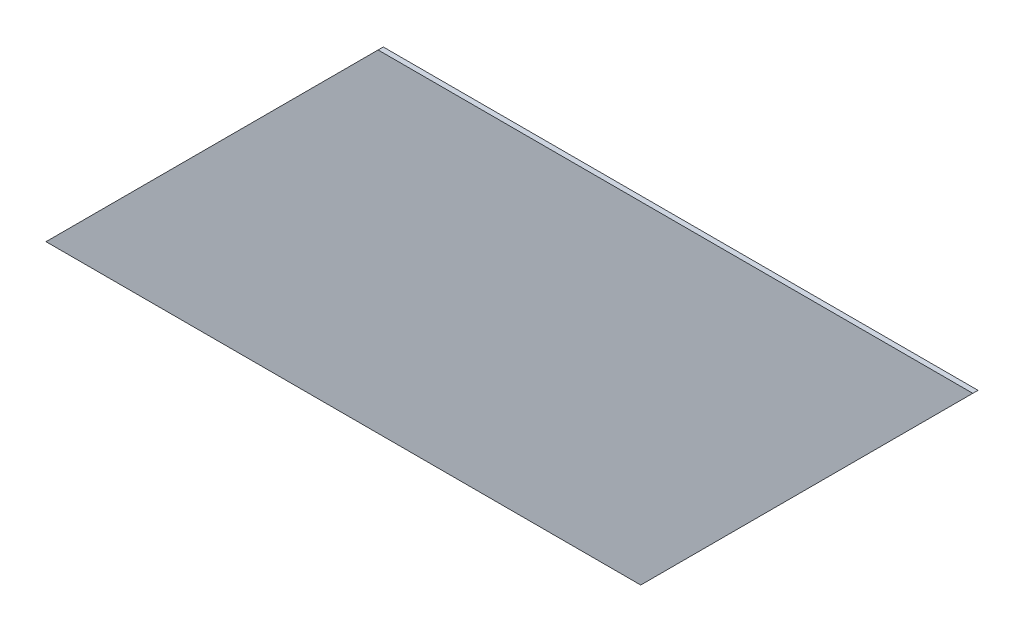
ISO-10303-21;
HEADER;
FILE_DESCRIPTION(('STEP AP214'),'2;1');
FILE_NAME('part.step','',(''),(''),'','','');
FILE_SCHEMA(('AUTOMOTIVE_DESIGN { 1 0 10303 214 1 1 1 1 }'));
ENDSEC;
DATA;
#1=APPLICATION_CONTEXT('core data for automotive mechanical design processes');
#2=APPLICATION_PROTOCOL_DEFINITION('international standard','automotive_design',2000,#1);
#3=PRODUCT_CONTEXT('',#1,'mechanical');
#4=PRODUCT('Part','Part','',(#3));
#5=PRODUCT_RELATED_PRODUCT_CATEGORY('part','',(#4));
#6=PRODUCT_DEFINITION_FORMATION('','',#4);
#7=PRODUCT_DEFINITION_CONTEXT('part definition',#1,'design');
#8=PRODUCT_DEFINITION('design','',#6,#7);
#9=PRODUCT_DEFINITION_SHAPE('','',#8);
#10=(LENGTH_UNIT() NAMED_UNIT(*) SI_UNIT(.MILLI.,.METRE.));
#11=(NAMED_UNIT(*) PLANE_ANGLE_UNIT() SI_UNIT($,.RADIAN.));
#12=(NAMED_UNIT(*) SI_UNIT($,.STERADIAN.) SOLID_ANGLE_UNIT());
#13=UNCERTAINTY_MEASURE_WITH_UNIT(LENGTH_MEASURE(1.E-05),#10,'distance_accuracy_value','');
#14=(GEOMETRIC_REPRESENTATION_CONTEXT(3) GLOBAL_UNCERTAINTY_ASSIGNED_CONTEXT((#13)) GLOBAL_UNIT_ASSIGNED_CONTEXT((#10,
#11,#12)) REPRESENTATION_CONTEXT('',''));
#15=CARTESIAN_POINT('',(0.,0.,0.));
#16=DIRECTION('',(0.,0.,1.));
#17=DIRECTION('',(1.,0.,0.));
#18=AXIS2_PLACEMENT_3D('',#15,#16,#17);
#19=CARTESIAN_POINT('',(-181.9529,-101.6,3.175));
#20=DIRECTION('',(0.707106781186549,-0.707106781186546,0.));
#21=DIRECTION('',(0.707106781186546,0.707106781186549,0.));
#22=AXIS2_PLACEMENT_3D('',#19,#20,#21);
#23=PLANE('',#22);
#24=DIRECTION('',(-0.707106781186546,-0.707106781186549,0.));
#25=VECTOR('',#24,1.);
#26=CARTESIAN_POINT('',(-181.9529,-101.6,0.));
#27=LINE('',#26,#25);
#28=CARTESIAN_POINT('',(21.2470999999992,101.6,0.));
#29=VERTEX_POINT('',#28);
#30=CARTESIAN_POINT('',(-181.9529,-101.6,0.));
#31=VERTEX_POINT('',#30);
#32=EDGE_CURVE('E87',#29,#31,#27,.T.);
#33=ORIENTED_EDGE('',*,*,#32,.T.);
#34=DIRECTION('',(0.,0.,-1.));
#35=VECTOR('',#34,1.);
#36=CARTESIAN_POINT('',(-181.9529,-101.6,3.175));
#37=LINE('',#36,#35);
#38=CARTESIAN_POINT('',(-181.9529,-101.6,3.175));
#39=VERTEX_POINT('',#38);
#40=EDGE_CURVE('E41',#39,#31,#37,.T.);
#41=ORIENTED_EDGE('',*,*,#40,.F.);
#42=DIRECTION('',(-0.707106781186546,-0.707106781186549,0.));
#43=VECTOR('',#42,1.);
#44=CARTESIAN_POINT('',(-181.9529,-101.6,3.175));
#45=LINE('',#44,#43);
#46=CARTESIAN_POINT('',(21.2470999999992,101.6,3.175));
#47=VERTEX_POINT('',#46);
#48=EDGE_CURVE('E80',#47,#39,#45,.T.);
#49=ORIENTED_EDGE('',*,*,#48,.F.);
#50=DIRECTION('',(0.,0.,-1.));
#51=VECTOR('',#50,1.);
#52=CARTESIAN_POINT('',(21.2470999999992,101.6,3.175));
#53=LINE('',#52,#51);
#54=EDGE_CURVE('E11',#47,#29,#53,.T.);
#55=ORIENTED_EDGE('',*,*,#54,.T.);
#56=EDGE_LOOP('',(#33,#41,#49,#55));
#57=FACE_BOUND('',#56,.T.);
#58=ADVANCED_FACE('F33',(#57),#23,.F.);
#59=CARTESIAN_POINT('',(-181.9529,-101.6,3.175));
#60=DIRECTION('',(0.,1.,0.));
#61=DIRECTION('',(0.,0.,1.));
#62=AXIS2_PLACEMENT_3D('',#59,#60,#61);
#63=PLANE('',#62);
#64=DIRECTION('',(1.,0.,0.));
#65=VECTOR('',#64,1.);
#66=CARTESIAN_POINT('',(-181.9529,-101.6,0.));
#67=LINE('',#66,#65);
#68=CARTESIAN_POINT('',(181.9529,-101.6,0.));
#69=VERTEX_POINT('',#68);
#70=EDGE_CURVE('E67',#31,#69,#67,.T.);
#71=ORIENTED_EDGE('',*,*,#70,.T.);
#72=DIRECTION('',(0.,0.,-1.));
#73=VECTOR('',#72,1.);
#74=CARTESIAN_POINT('',(181.9529,-101.6,3.175));
#75=LINE('',#74,#73);
#76=CARTESIAN_POINT('',(181.9529,-101.6,3.175));
#77=VERTEX_POINT('',#76);
#78=EDGE_CURVE('E88',#77,#69,#75,.T.);
#79=ORIENTED_EDGE('',*,*,#78,.F.);
#80=DIRECTION('',(1.,0.,0.));
#81=VECTOR('',#80,1.);
#82=CARTESIAN_POINT('',(-181.9529,-101.6,3.175));
#83=LINE('',#82,#81);
#84=EDGE_CURVE('E84',#39,#77,#83,.T.);
#85=ORIENTED_EDGE('',*,*,#84,.F.);
#86=ORIENTED_EDGE('',*,*,#40,.T.);
#87=EDGE_LOOP('',(#71,#79,#85,#86));
#88=FACE_BOUND('',#87,.T.);
#89=ADVANCED_FACE('F89',(#88),#63,.F.);
#90=CARTESIAN_POINT('',(181.9529,-101.6,3.175));
#91=DIRECTION('',(-0.707106781186549,0.707106781186546,0.));
#92=DIRECTION('',(-0.707106781186546,-0.707106781186549,0.));
#93=AXIS2_PLACEMENT_3D('',#90,#91,#92);
#94=PLANE('',#93);
#95=DIRECTION('',(0.707106781186546,0.707106781186549,0.));
#96=VECTOR('',#95,1.);
#97=CARTESIAN_POINT('',(181.9529,-101.6,0.));
#98=LINE('',#97,#96);
#99=CARTESIAN_POINT('',(385.152899999999,101.6,0.));
#100=VERTEX_POINT('',#99);
#101=EDGE_CURVE('E74',#69,#100,#98,.T.);
#102=ORIENTED_EDGE('',*,*,#101,.T.);
#103=DIRECTION('',(0.,0.,-1.));
#104=VECTOR('',#103,1.);
#105=CARTESIAN_POINT('',(385.152899999999,101.6,3.175));
#106=LINE('',#105,#104);
#107=CARTESIAN_POINT('',(385.152899999999,101.6,3.175));
#108=VERTEX_POINT('',#107);
#109=EDGE_CURVE('E93',#108,#100,#106,.T.);
#110=ORIENTED_EDGE('',*,*,#109,.F.);
#111=DIRECTION('',(0.707106781186546,0.707106781186549,0.));
#112=VECTOR('',#111,1.);
#113=CARTESIAN_POINT('',(181.9529,-101.6,3.175));
#114=LINE('',#113,#112);
#115=EDGE_CURVE('E91',#77,#108,#114,.T.);
#116=ORIENTED_EDGE('',*,*,#115,.F.);
#117=ORIENTED_EDGE('',*,*,#78,.T.);
#118=EDGE_LOOP('',(#102,#110,#116,#117));
#119=FACE_BOUND('',#118,.T.);
#120=ADVANCED_FACE('F103',(#119),#94,.F.);
#121=CARTESIAN_POINT('',(385.152899999999,101.6,3.175));
#122=DIRECTION('',(0.,-1.,0.));
#123=DIRECTION('',(0.,0.,-1.));
#124=AXIS2_PLACEMENT_3D('',#121,#122,#123);
#125=PLANE('',#124);
#126=DIRECTION('',(-1.,0.,0.));
#127=VECTOR('',#126,1.);
#128=CARTESIAN_POINT('',(385.152899999999,101.6,0.));
#129=LINE('',#128,#127);
#130=EDGE_CURVE('E100',#100,#29,#129,.T.);
#131=ORIENTED_EDGE('',*,*,#130,.T.);
#132=ORIENTED_EDGE('',*,*,#54,.F.);
#133=DIRECTION('',(-1.,0.,0.));
#134=VECTOR('',#133,1.);
#135=CARTESIAN_POINT('',(21.2470999999992,101.6,3.175));
#136=LINE('',#135,#134);
#137=EDGE_CURVE('E49',#108,#47,#136,.T.);
#138=ORIENTED_EDGE('',*,*,#137,.F.);
#139=ORIENTED_EDGE('',*,*,#109,.T.);
#140=EDGE_LOOP('',(#131,#132,#138,#139));
#141=FACE_BOUND('',#140,.T.);
#142=ADVANCED_FACE('F107',(#141),#125,.F.);
#143=CARTESIAN_POINT('',(0.,0.,3.175));
#144=DIRECTION('',(0.,0.,1.));
#145=DIRECTION('',(1.,0.,0.));
#146=AXIS2_PLACEMENT_3D('',#143,#144,#145);
#147=PLANE('',#146);
#148=ORIENTED_EDGE('',*,*,#137,.T.);
#149=ORIENTED_EDGE('',*,*,#48,.T.);
#150=ORIENTED_EDGE('',*,*,#84,.T.);
#151=ORIENTED_EDGE('',*,*,#115,.T.);
#152=EDGE_LOOP('',(#148,#149,#150,#151));
#153=FACE_BOUND('',#152,.T.);
#154=ADVANCED_FACE('F82',(#153),#147,.T.);
#155=CARTESIAN_POINT('',(0.,0.,0.));
#156=DIRECTION('',(0.,0.,1.));
#157=DIRECTION('',(1.,0.,0.));
#158=AXIS2_PLACEMENT_3D('',#155,#156,#157);
#159=PLANE('',#158);
#160=ORIENTED_EDGE('',*,*,#32,.F.);
#161=ORIENTED_EDGE('',*,*,#130,.F.);
#162=ORIENTED_EDGE('',*,*,#101,.F.);
#163=ORIENTED_EDGE('',*,*,#70,.F.);
#164=EDGE_LOOP('',(#160,#161,#162,#163));
#165=FACE_BOUND('',#164,.T.);
#166=ADVANCED_FACE('F106',(#165),#159,.F.);
#167=CLOSED_SHELL('',(#58,#89,#120,#142,#154,#166));
#168=MANIFOLD_SOLID_BREP('B2',#167);
#169=ADVANCED_BREP_SHAPE_REPRESENTATION('',(#18,#168),#14);
#170=SHAPE_DEFINITION_REPRESENTATION(#9,#169);
ENDSEC;
END-ISO-10303-21;
